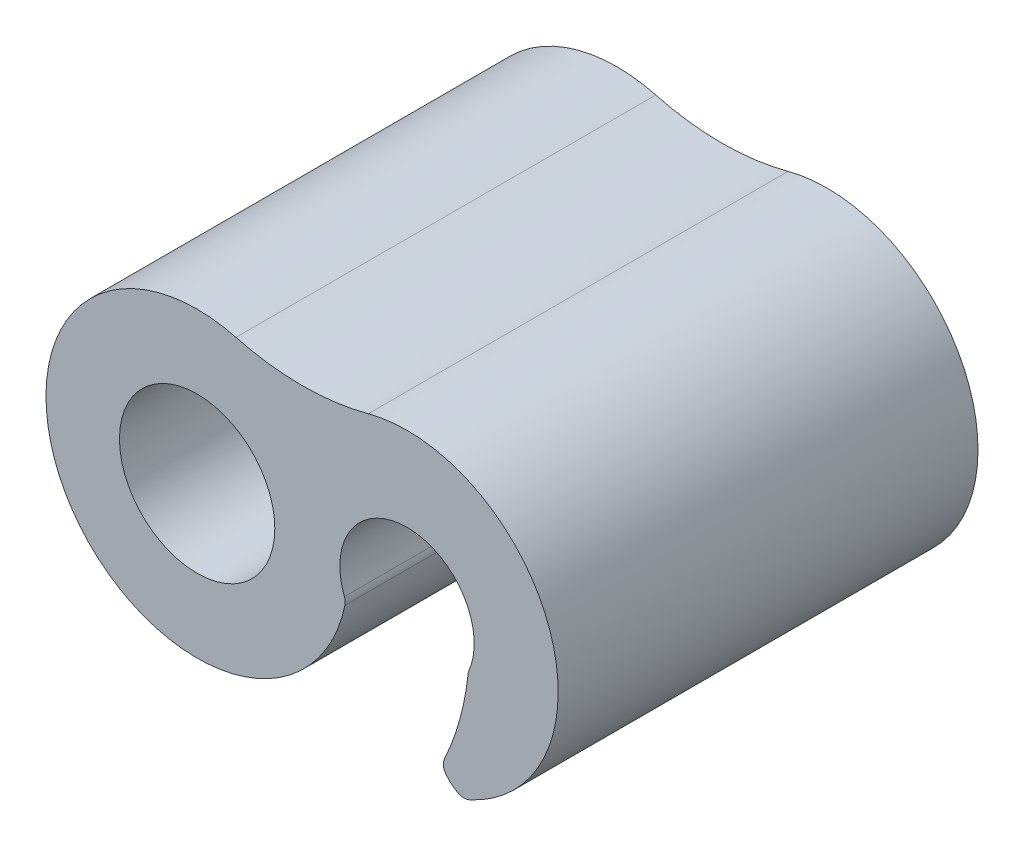
ISO-10303-21;
HEADER;
FILE_DESCRIPTION(('STEP AP214'),'2;1');
FILE_NAME('part.step','',(''),(''),'','','');
FILE_SCHEMA(('AUTOMOTIVE_DESIGN { 1 0 10303 214 1 1 1 1 }'));
ENDSEC;
DATA;
#1=APPLICATION_CONTEXT('core data for automotive mechanical design processes');
#2=APPLICATION_PROTOCOL_DEFINITION('international standard','automotive_design',2000,#1);
#3=PRODUCT_CONTEXT('',#1,'mechanical');
#4=PRODUCT('Part','Part','',(#3));
#5=PRODUCT_RELATED_PRODUCT_CATEGORY('part','',(#4));
#6=PRODUCT_DEFINITION_FORMATION('','',#4);
#7=PRODUCT_DEFINITION_CONTEXT('part definition',#1,'design');
#8=PRODUCT_DEFINITION('design','',#6,#7);
#9=PRODUCT_DEFINITION_SHAPE('','',#8);
#10=(LENGTH_UNIT() NAMED_UNIT(*) SI_UNIT(.MILLI.,.METRE.));
#11=(NAMED_UNIT(*) PLANE_ANGLE_UNIT() SI_UNIT($,.RADIAN.));
#12=(NAMED_UNIT(*) SI_UNIT($,.STERADIAN.) SOLID_ANGLE_UNIT());
#13=UNCERTAINTY_MEASURE_WITH_UNIT(LENGTH_MEASURE(1.E-05),#10,'distance_accuracy_value','');
#14=(GEOMETRIC_REPRESENTATION_CONTEXT(3) GLOBAL_UNCERTAINTY_ASSIGNED_CONTEXT((#13)) GLOBAL_UNIT_ASSIGNED_CONTEXT((#10,
#11,#12)) REPRESENTATION_CONTEXT('',''));
#15=CARTESIAN_POINT('',(0.,0.,0.));
#16=DIRECTION('',(0.,0.,1.));
#17=DIRECTION('',(1.,0.,0.));
#18=AXIS2_PLACEMENT_3D('',#15,#16,#17);
#19=CARTESIAN_POINT('',(0.,0.,10.));
#20=DIRECTION('',(0.,0.,1.));
#21=DIRECTION('',(1.,0.,0.));
#22=AXIS2_PLACEMENT_3D('',#19,#20,#21);
#23=PLANE('',#22);
#24=CARTESIAN_POINT('',(4.2,-2.4,10.));
#25=DIRECTION('',(0.,0.,1.));
#26=DIRECTION('',(-1.,0.,0.));
#27=AXIS2_PLACEMENT_3D('',#24,#25,#26);
#28=CIRCLE('',#27,1.);
#29=CARTESIAN_POINT('',(3.43631724890031,-3.04559170973054,10.));
#30=VERTEX_POINT('',#29);
#31=CARTESIAN_POINT('',(3.70700969182109,-3.27003480162673,10.));
#32=VERTEX_POINT('',#31);
#33=EDGE_CURVE('E114',#30,#32,#28,.T.);
#34=ORIENTED_EDGE('',*,*,#33,.T.);
#35=CARTESIAN_POINT('',(3.85490678427476,-3.00902436113871,10.));
#36=DIRECTION('',(0.,0.,1.));
#37=DIRECTION('',(1.,0.,0.));
#38=AXIS2_PLACEMENT_3D('',#35,#36,#37);
#39=CIRCLE('',#38,0.3);
#40=CARTESIAN_POINT('',(3.97808012829974,-3.28257203033314,10.));
#41=VERTEX_POINT('',#40);
#42=EDGE_CURVE('E110',#32,#41,#39,.T.);
#43=ORIENTED_EDGE('',*,*,#42,.T.);
#44=CARTESIAN_POINT('',(2.5,0.,10.));
#45=DIRECTION('',(0.,0.,1.));
#46=DIRECTION('',(1.,0.,0.));
#47=AXIS2_PLACEMENT_3D('',#44,#45,#46);
#48=CIRCLE('',#47,3.6);
#49=CARTESIAN_POINT('',(1.57550208410066,3.47926768207015,10.));
#50=VERTEX_POINT('',#49);
#51=EDGE_CURVE('E102',#41,#50,#48,.T.);
#52=ORIENTED_EDGE('',*,*,#51,.T.);
#53=CARTESIAN_POINT('',(0.,9.40853305949747,10.));
#54=DIRECTION('',(0.,0.,-1.));
#55=DIRECTION('',(1.,0.,0.));
#56=AXIS2_PLACEMENT_3D('',#53,#54,#55);
#57=CIRCLE('',#56,6.13501383315179);
#58=CARTESIAN_POINT('',(-1.57550208410067,3.47926768207015,10.));
#59=VERTEX_POINT('',#58);
#60=EDGE_CURVE('E107',#50,#59,#57,.T.);
#61=ORIENTED_EDGE('',*,*,#60,.T.);
#62=CARTESIAN_POINT('',(-2.5,0.,10.));
#63=DIRECTION('',(0.,0.,1.));
#64=DIRECTION('',(1.,0.,0.));
#65=AXIS2_PLACEMENT_3D('',#62,#63,#64);
#66=CIRCLE('',#65,3.6);
#67=CARTESIAN_POINT('',(1.02145454545455,-0.747902322698307,10.));
#68=VERTEX_POINT('',#67);
#69=EDGE_CURVE('E128',#59,#68,#66,.T.);
#70=ORIENTED_EDGE('',*,*,#69,.T.);
#71=CARTESIAN_POINT('',(0.728,-0.685577129140115,10.));
#72=DIRECTION('',(0.,0.,1.));
#73=DIRECTION('',(1.,0.,0.));
#74=AXIS2_PLACEMENT_3D('',#71,#72,#73);
#75=CIRCLE('',#74,0.3);
#76=CARTESIAN_POINT('',(1.00778947368421,-0.57732810874957,10.));
#77=VERTEX_POINT('',#76);
#78=EDGE_CURVE('E48',#68,#77,#75,.T.);
#79=ORIENTED_EDGE('',*,*,#78,.T.);
#80=CARTESIAN_POINT('',(2.5,0.,10.));
#81=DIRECTION('',(0.,0.,-1.));
#82=DIRECTION('',(1.,0.,0.));
#83=AXIS2_PLACEMENT_3D('',#80,#81,#82);
#84=CIRCLE('',#83,1.6);
#85=CARTESIAN_POINT('',(3.96,-0.654522726878144,10.));
#86=VERTEX_POINT('',#85);
#87=EDGE_CURVE('E130',#77,#86,#84,.T.);
#88=ORIENTED_EDGE('',*,*,#87,.T.);
#89=CARTESIAN_POINT('',(-2.5,0.,10.));
#90=DIRECTION('',(0.,0.,-1.));
#91=DIRECTION('',(1.,0.,0.));
#92=AXIS2_PLACEMENT_3D('',#89,#90,#91);
#93=CIRCLE('',#92,6.49307323229917);
#94=CARTESIAN_POINT('',(3.39314080196679,-2.72596615683215,10.));
#95=VERTEX_POINT('',#94);
#96=EDGE_CURVE('E150',#86,#95,#93,.T.);
#97=ORIENTED_EDGE('',*,*,#96,.T.);
#98=CARTESIAN_POINT('',(3.66542207423021,-2.85191419681138,10.));
#99=DIRECTION('',(0.,0.,1.));
#100=DIRECTION('',(1.,0.,0.));
#101=AXIS2_PLACEMENT_3D('',#98,#99,#100);
#102=CIRCLE('',#101,0.3);
#103=EDGE_CURVE('E167',#95,#30,#102,.T.);
#104=ORIENTED_EDGE('',*,*,#103,.T.);
#105=EDGE_LOOP('',(#34,#43,#52,#61,#70,#79,#88,#97,#104));
#106=FACE_BOUND('',#105,.T.);
#107=CARTESIAN_POINT('',(-2.5,0.,10.));
#108=DIRECTION('',(0.,0.,1.));
#109=DIRECTION('',(1.,0.,0.));
#110=AXIS2_PLACEMENT_3D('',#107,#108,#109);
#111=CIRCLE('',#110,1.85);
#112=CARTESIAN_POINT('',(-0.65,0.,10.));
#113=VERTEX_POINT('',#112);
#114=EDGE_CURVE('E140',#113,#113,#111,.T.);
#115=ORIENTED_EDGE('',*,*,#114,.F.);
#116=EDGE_LOOP('',(#115));
#117=FACE_BOUND('',#116,.T.);
#118=ADVANCED_FACE('F33',(#106,#117),#23,.T.);
#119=CARTESIAN_POINT('',(0.,0.,0.));
#120=DIRECTION('',(0.,0.,1.));
#121=DIRECTION('',(1.,0.,0.));
#122=AXIS2_PLACEMENT_3D('',#119,#120,#121);
#123=PLANE('',#122);
#124=CARTESIAN_POINT('',(2.5,0.,0.));
#125=DIRECTION('',(0.,0.,1.));
#126=DIRECTION('',(1.,0.,0.));
#127=AXIS2_PLACEMENT_3D('',#124,#125,#126);
#128=CIRCLE('',#127,3.6);
#129=CARTESIAN_POINT('',(3.97808012829974,-3.28257203033314,0.));
#130=VERTEX_POINT('',#129);
#131=CARTESIAN_POINT('',(1.57550208410066,3.47926768207015,0.));
#132=VERTEX_POINT('',#131);
#133=EDGE_CURVE('E120',#130,#132,#128,.T.);
#134=ORIENTED_EDGE('',*,*,#133,.F.);
#135=CARTESIAN_POINT('',(3.85490678427476,-3.00902436113871,0.));
#136=DIRECTION('',(0.,0.,1.));
#137=DIRECTION('',(1.,0.,0.));
#138=AXIS2_PLACEMENT_3D('',#135,#136,#137);
#139=CIRCLE('',#138,0.3);
#140=CARTESIAN_POINT('',(3.70700969182109,-3.27003480162673,0.));
#141=VERTEX_POINT('',#140);
#142=EDGE_CURVE('E159',#130,#141,#139,.F.);
#143=ORIENTED_EDGE('',*,*,#142,.T.);
#144=CARTESIAN_POINT('',(4.2,-2.4,0.));
#145=DIRECTION('',(0.,0.,1.));
#146=DIRECTION('',(-1.,0.,0.));
#147=AXIS2_PLACEMENT_3D('',#144,#145,#146);
#148=CIRCLE('',#147,1.);
#149=CARTESIAN_POINT('',(3.43631724890031,-3.04559170973054,0.));
#150=VERTEX_POINT('',#149);
#151=EDGE_CURVE('E139',#150,#141,#148,.T.);
#152=ORIENTED_EDGE('',*,*,#151,.F.);
#153=CARTESIAN_POINT('',(3.66542207423021,-2.85191419681138,0.));
#154=DIRECTION('',(0.,0.,1.));
#155=DIRECTION('',(1.,0.,0.));
#156=AXIS2_PLACEMENT_3D('',#153,#154,#155);
#157=CIRCLE('',#156,0.3);
#158=CARTESIAN_POINT('',(3.39314080196679,-2.72596615683215,0.));
#159=VERTEX_POINT('',#158);
#160=EDGE_CURVE('E157',#150,#159,#157,.F.);
#161=ORIENTED_EDGE('',*,*,#160,.T.);
#162=CARTESIAN_POINT('',(-2.5,0.,0.));
#163=DIRECTION('',(0.,0.,-1.));
#164=DIRECTION('',(1.,0.,0.));
#165=AXIS2_PLACEMENT_3D('',#162,#163,#164);
#166=CIRCLE('',#165,6.49307323229917);
#167=CARTESIAN_POINT('',(3.96,-0.654522726878144,0.));
#168=VERTEX_POINT('',#167);
#169=EDGE_CURVE('E136',#168,#159,#166,.T.);
#170=ORIENTED_EDGE('',*,*,#169,.F.);
#171=CARTESIAN_POINT('',(2.5,0.,0.));
#172=DIRECTION('',(0.,0.,-1.));
#173=DIRECTION('',(1.,0.,0.));
#174=AXIS2_PLACEMENT_3D('',#171,#172,#173);
#175=CIRCLE('',#174,1.6);
#176=CARTESIAN_POINT('',(1.00778947368421,-0.57732810874957,0.));
#177=VERTEX_POINT('',#176);
#178=EDGE_CURVE('E148',#177,#168,#175,.T.);
#179=ORIENTED_EDGE('',*,*,#178,.F.);
#180=CARTESIAN_POINT('',(0.728,-0.685577129140115,0.));
#181=DIRECTION('',(0.,0.,1.));
#182=DIRECTION('',(1.,0.,0.));
#183=AXIS2_PLACEMENT_3D('',#180,#181,#182);
#184=CIRCLE('',#183,0.3);
#185=CARTESIAN_POINT('',(1.02145454545455,-0.747902322698307,0.));
#186=VERTEX_POINT('',#185);
#187=EDGE_CURVE('E155',#177,#186,#184,.F.);
#188=ORIENTED_EDGE('',*,*,#187,.T.);
#189=CARTESIAN_POINT('',(-2.5,0.,0.));
#190=DIRECTION('',(0.,0.,1.));
#191=DIRECTION('',(1.,0.,0.));
#192=AXIS2_PLACEMENT_3D('',#189,#190,#191);
#193=CIRCLE('',#192,3.6);
#194=CARTESIAN_POINT('',(-1.57550208410067,3.47926768207015,0.));
#195=VERTEX_POINT('',#194);
#196=EDGE_CURVE('E146',#195,#186,#193,.T.);
#197=ORIENTED_EDGE('',*,*,#196,.F.);
#198=CARTESIAN_POINT('',(0.,9.40853305949747,0.));
#199=DIRECTION('',(0.,0.,-1.));
#200=DIRECTION('',(1.,0.,0.));
#201=AXIS2_PLACEMENT_3D('',#198,#199,#200);
#202=CIRCLE('',#201,6.13501383315179);
#203=EDGE_CURVE('E144',#132,#195,#202,.T.);
#204=ORIENTED_EDGE('',*,*,#203,.F.);
#205=EDGE_LOOP('',(#134,#143,#152,#161,#170,#179,#188,#197,#204));
#206=FACE_BOUND('',#205,.T.);
#207=CARTESIAN_POINT('',(-2.5,0.,0.));
#208=DIRECTION('',(0.,0.,1.));
#209=DIRECTION('',(1.,0.,0.));
#210=AXIS2_PLACEMENT_3D('',#207,#208,#209);
#211=CIRCLE('',#210,1.85);
#212=CARTESIAN_POINT('',(-0.65,0.,0.));
#213=VERTEX_POINT('',#212);
#214=EDGE_CURVE('E199',#213,#213,#211,.T.);
#215=ORIENTED_EDGE('',*,*,#214,.T.);
#216=EDGE_LOOP('',(#215));
#217=FACE_BOUND('',#216,.T.);
#218=ADVANCED_FACE('F180',(#206,#217),#123,.F.);
#219=CARTESIAN_POINT('',(-2.5,0.,10.));
#220=DIRECTION('',(0.,0.,-1.));
#221=DIRECTION('',(-1.,0.,0.));
#222=AXIS2_PLACEMENT_3D('',#219,#220,#221);
#223=CYLINDRICAL_SURFACE('',#222,6.49307323229917);
#224=ORIENTED_EDGE('',*,*,#169,.T.);
#225=DIRECTION('',(0.,0.,-1.));
#226=VECTOR('',#225,1.);
#227=CARTESIAN_POINT('',(3.39314080196679,-2.72596615683215,10.));
#228=LINE('',#227,#226);
#229=EDGE_CURVE('E170',#159,#95,#228,.F.);
#230=ORIENTED_EDGE('',*,*,#229,.T.);
#231=ORIENTED_EDGE('',*,*,#96,.F.);
#232=DIRECTION('',(0.,0.,-1.));
#233=VECTOR('',#232,1.);
#234=CARTESIAN_POINT('',(3.96,-0.654522726878144,10.));
#235=LINE('',#234,#233);
#236=EDGE_CURVE('E135',#86,#168,#235,.T.);
#237=ORIENTED_EDGE('',*,*,#236,.T.);
#238=EDGE_LOOP('',(#224,#230,#231,#237));
#239=FACE_BOUND('',#238,.T.);
#240=ADVANCED_FACE('F186',(#239),#223,.F.);
#241=CARTESIAN_POINT('',(4.2,-2.4,10.));
#242=DIRECTION('',(0.,0.,-1.));
#243=DIRECTION('',(-1.,0.,0.));
#244=AXIS2_PLACEMENT_3D('',#241,#242,#243);
#245=CYLINDRICAL_SURFACE('',#244,1.);
#246=ORIENTED_EDGE('',*,*,#151,.T.);
#247=DIRECTION('',(0.,0.,-1.));
#248=VECTOR('',#247,1.);
#249=CARTESIAN_POINT('',(3.70700969182109,-3.27003480162673,10.));
#250=LINE('',#249,#248);
#251=EDGE_CURVE('E164',#141,#32,#250,.F.);
#252=ORIENTED_EDGE('',*,*,#251,.T.);
#253=ORIENTED_EDGE('',*,*,#33,.F.);
#254=DIRECTION('',(0.,0.,-1.));
#255=VECTOR('',#254,1.);
#256=CARTESIAN_POINT('',(3.43631724890031,-3.04559170973054,10.));
#257=LINE('',#256,#255);
#258=EDGE_CURVE('E161',#30,#150,#257,.T.);
#259=ORIENTED_EDGE('',*,*,#258,.T.);
#260=EDGE_LOOP('',(#246,#252,#253,#259));
#261=FACE_BOUND('',#260,.T.);
#262=ADVANCED_FACE('F195',(#261),#245,.T.);
#263=CARTESIAN_POINT('',(2.5,0.,10.));
#264=DIRECTION('',(0.,0.,-1.));
#265=DIRECTION('',(-1.,0.,0.));
#266=AXIS2_PLACEMENT_3D('',#263,#264,#265);
#267=CYLINDRICAL_SURFACE('',#266,3.6);
#268=ORIENTED_EDGE('',*,*,#51,.F.);
#269=DIRECTION('',(0.,0.,-1.));
#270=VECTOR('',#269,1.);
#271=CARTESIAN_POINT('',(3.97808012829974,-3.28257203033314,10.));
#272=LINE('',#271,#270);
#273=EDGE_CURVE('E123',#41,#130,#272,.T.);
#274=ORIENTED_EDGE('',*,*,#273,.T.);
#275=ORIENTED_EDGE('',*,*,#133,.T.);
#276=DIRECTION('',(0.,0.,-1.));
#277=VECTOR('',#276,1.);
#278=CARTESIAN_POINT('',(1.57550208410066,3.47926768207015,10.));
#279=LINE('',#278,#277);
#280=EDGE_CURVE('E117',#50,#132,#279,.T.);
#281=ORIENTED_EDGE('',*,*,#280,.F.);
#282=EDGE_LOOP('',(#268,#274,#275,#281));
#283=FACE_BOUND('',#282,.T.);
#284=ADVANCED_FACE('F118',(#283),#267,.T.);
#285=CARTESIAN_POINT('',(0.,9.40853305949747,10.));
#286=DIRECTION('',(0.,0.,-1.));
#287=DIRECTION('',(-1.,0.,0.));
#288=AXIS2_PLACEMENT_3D('',#285,#286,#287);
#289=CYLINDRICAL_SURFACE('',#288,6.13501383315179);
#290=ORIENTED_EDGE('',*,*,#203,.T.);
#291=DIRECTION('',(0.,0.,-1.));
#292=VECTOR('',#291,1.);
#293=CARTESIAN_POINT('',(-1.57550208410067,3.47926768207015,10.));
#294=LINE('',#293,#292);
#295=EDGE_CURVE('E124',#59,#195,#294,.T.);
#296=ORIENTED_EDGE('',*,*,#295,.F.);
#297=ORIENTED_EDGE('',*,*,#60,.F.);
#298=ORIENTED_EDGE('',*,*,#280,.T.);
#299=EDGE_LOOP('',(#290,#296,#297,#298));
#300=FACE_BOUND('',#299,.T.);
#301=ADVANCED_FACE('F126',(#300),#289,.F.);
#302=CARTESIAN_POINT('',(-2.5,0.,10.));
#303=DIRECTION('',(0.,0.,-1.));
#304=DIRECTION('',(-1.,0.,0.));
#305=AXIS2_PLACEMENT_3D('',#302,#303,#304);
#306=CYLINDRICAL_SURFACE('',#305,3.6);
#307=ORIENTED_EDGE('',*,*,#196,.T.);
#308=DIRECTION('',(0.,0.,-1.));
#309=VECTOR('',#308,1.);
#310=CARTESIAN_POINT('',(1.02145454545455,-0.747902322698307,10.));
#311=LINE('',#310,#309);
#312=EDGE_CURVE('E11',#186,#68,#311,.F.);
#313=ORIENTED_EDGE('',*,*,#312,.T.);
#314=ORIENTED_EDGE('',*,*,#69,.F.);
#315=ORIENTED_EDGE('',*,*,#295,.T.);
#316=EDGE_LOOP('',(#307,#313,#314,#315));
#317=FACE_BOUND('',#316,.T.);
#318=ADVANCED_FACE('F217',(#317),#306,.T.);
#319=CARTESIAN_POINT('',(2.5,0.,10.));
#320=DIRECTION('',(0.,0.,-1.));
#321=DIRECTION('',(-1.,0.,0.));
#322=AXIS2_PLACEMENT_3D('',#319,#320,#321);
#323=CYLINDRICAL_SURFACE('',#322,1.6);
#324=ORIENTED_EDGE('',*,*,#87,.F.);
#325=DIRECTION('',(0.,0.,-1.));
#326=VECTOR('',#325,1.);
#327=CARTESIAN_POINT('',(1.00778947368421,-0.57732810874957,10.));
#328=LINE('',#327,#326);
#329=EDGE_CURVE('E41',#77,#177,#328,.T.);
#330=ORIENTED_EDGE('',*,*,#329,.T.);
#331=ORIENTED_EDGE('',*,*,#178,.T.);
#332=ORIENTED_EDGE('',*,*,#236,.F.);
#333=EDGE_LOOP('',(#324,#330,#331,#332));
#334=FACE_BOUND('',#333,.T.);
#335=ADVANCED_FACE('F175',(#334),#323,.F.);
#336=CARTESIAN_POINT('',(-2.5,0.,10.));
#337=DIRECTION('',(0.,0.,-1.));
#338=DIRECTION('',(-1.,0.,0.));
#339=AXIS2_PLACEMENT_3D('',#336,#337,#338);
#340=CYLINDRICAL_SURFACE('',#339,1.85);
#341=ORIENTED_EDGE('',*,*,#114,.T.);
#342=EDGE_LOOP('',(#341));
#343=FACE_BOUND('',#342,.T.);
#344=ORIENTED_EDGE('',*,*,#214,.F.);
#345=EDGE_LOOP('',(#344));
#346=FACE_BOUND('',#345,.T.);
#347=ADVANCED_FACE('F205',(#343,#346),#340,.F.);
#348=CARTESIAN_POINT('',(3.85490678427476,-3.00902436113871,10.));
#349=DIRECTION('',(0.,0.,-1.));
#350=DIRECTION('',(-1.,0.,0.));
#351=AXIS2_PLACEMENT_3D('',#348,#349,#350);
#352=CYLINDRICAL_SURFACE('',#351,0.3);
#353=ORIENTED_EDGE('',*,*,#42,.F.);
#354=ORIENTED_EDGE('',*,*,#251,.F.);
#355=ORIENTED_EDGE('',*,*,#142,.F.);
#356=ORIENTED_EDGE('',*,*,#273,.F.);
#357=EDGE_LOOP('',(#353,#354,#355,#356));
#358=FACE_BOUND('',#357,.T.);
#359=ADVANCED_FACE('F228',(#358),#352,.T.);
#360=CARTESIAN_POINT('',(3.66542207423021,-2.85191419681138,10.));
#361=DIRECTION('',(0.,0.,1.));
#362=DIRECTION('',(1.,0.,0.));
#363=AXIS2_PLACEMENT_3D('',#360,#361,#362);
#364=CYLINDRICAL_SURFACE('',#363,0.3);
#365=ORIENTED_EDGE('',*,*,#103,.F.);
#366=ORIENTED_EDGE('',*,*,#229,.F.);
#367=ORIENTED_EDGE('',*,*,#160,.F.);
#368=ORIENTED_EDGE('',*,*,#258,.F.);
#369=EDGE_LOOP('',(#365,#366,#367,#368));
#370=FACE_BOUND('',#369,.T.);
#371=ADVANCED_FACE('F191',(#370),#364,.T.);
#372=CARTESIAN_POINT('',(0.728,-0.685577129140115,10.));
#373=DIRECTION('',(0.,0.,1.));
#374=DIRECTION('',(1.,0.,0.));
#375=AXIS2_PLACEMENT_3D('',#372,#373,#374);
#376=CYLINDRICAL_SURFACE('',#375,0.3);
#377=ORIENTED_EDGE('',*,*,#78,.F.);
#378=ORIENTED_EDGE('',*,*,#312,.F.);
#379=ORIENTED_EDGE('',*,*,#187,.F.);
#380=ORIENTED_EDGE('',*,*,#329,.F.);
#381=EDGE_LOOP('',(#377,#378,#379,#380));
#382=FACE_BOUND('',#381,.T.);
#383=ADVANCED_FACE('F35',(#382),#376,.T.);
#384=CLOSED_SHELL('',(#118,#218,#240,#262,#284,#301,#318,#335,#347,#359,#371,#383));
#385=MANIFOLD_SOLID_BREP('B2',#384);
#386=ADVANCED_BREP_SHAPE_REPRESENTATION('',(#18,#385),#14);
#387=SHAPE_DEFINITION_REPRESENTATION(#9,#386);
ENDSEC;
END-ISO-10303-21;
